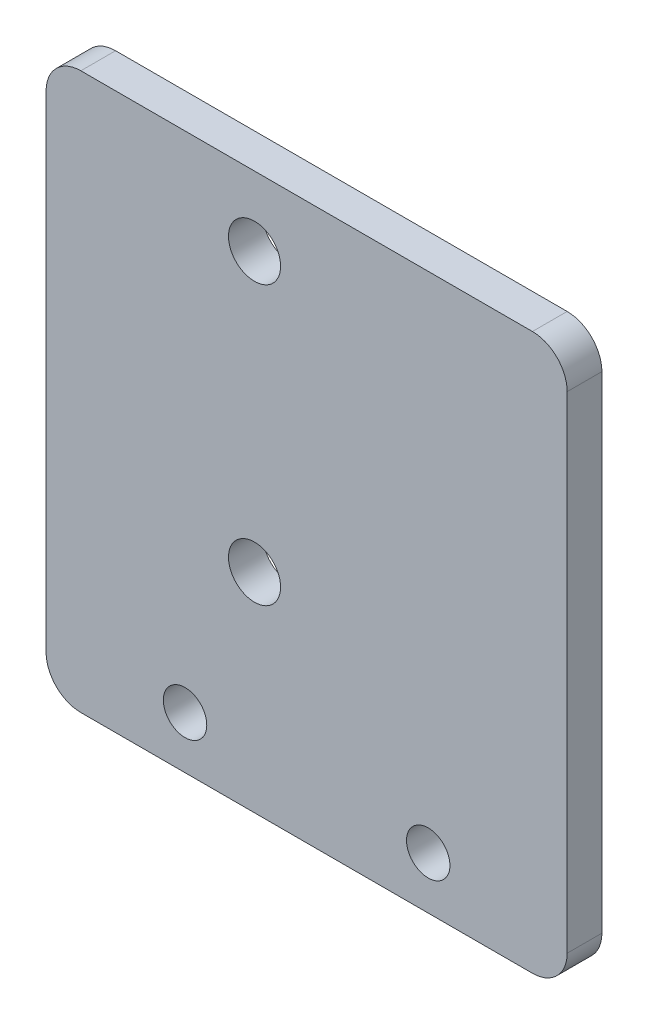
ISO-10303-21;
HEADER;
FILE_DESCRIPTION(('STEP AP214'),'2;1');
FILE_NAME('part.step','',(''),(''),'','','');
FILE_SCHEMA(('AUTOMOTIVE_DESIGN { 1 0 10303 214 1 1 1 1 }'));
ENDSEC;
DATA;
#1=APPLICATION_CONTEXT('core data for automotive mechanical design processes');
#2=APPLICATION_PROTOCOL_DEFINITION('international standard','automotive_design',2000,#1);
#3=PRODUCT_CONTEXT('',#1,'mechanical');
#4=PRODUCT('Part','Part','',(#3));
#5=PRODUCT_RELATED_PRODUCT_CATEGORY('part','',(#4));
#6=PRODUCT_DEFINITION_FORMATION('','',#4);
#7=PRODUCT_DEFINITION_CONTEXT('part definition',#1,'design');
#8=PRODUCT_DEFINITION('design','',#6,#7);
#9=PRODUCT_DEFINITION_SHAPE('','',#8);
#10=(LENGTH_UNIT() NAMED_UNIT(*) SI_UNIT(.MILLI.,.METRE.));
#11=(NAMED_UNIT(*) PLANE_ANGLE_UNIT() SI_UNIT($,.RADIAN.));
#12=(NAMED_UNIT(*) SI_UNIT($,.STERADIAN.) SOLID_ANGLE_UNIT());
#13=UNCERTAINTY_MEASURE_WITH_UNIT(LENGTH_MEASURE(1.E-05),#10,'distance_accuracy_value','');
#14=(GEOMETRIC_REPRESENTATION_CONTEXT(3) GLOBAL_UNCERTAINTY_ASSIGNED_CONTEXT((#13)) GLOBAL_UNIT_ASSIGNED_CONTEXT((#10,
#11,#12)) REPRESENTATION_CONTEXT('',''));
#15=CARTESIAN_POINT('',(0.,0.,0.));
#16=DIRECTION('',(0.,0.,1.));
#17=DIRECTION('',(1.,0.,0.));
#18=AXIS2_PLACEMENT_3D('',#15,#16,#17);
#19=CARTESIAN_POINT('',(0.,0.,2.));
#20=DIRECTION('',(0.,0.,-1.));
#21=DIRECTION('',(-1.,0.,0.));
#22=AXIS2_PLACEMENT_3D('',#19,#20,#21);
#23=PLANE('',#22);
#24=DIRECTION('',(0.,-1.,0.));
#25=VECTOR('',#24,1.);
#26=CARTESIAN_POINT('',(0.,0.,2.));
#27=LINE('',#26,#25);
#28=CARTESIAN_POINT('',(0.,30.,2.));
#29=VERTEX_POINT('',#28);
#30=CARTESIAN_POINT('',(0.,2.,2.));
#31=VERTEX_POINT('',#30);
#32=EDGE_CURVE('E150',#29,#31,#27,.T.);
#33=ORIENTED_EDGE('',*,*,#32,.T.);
#34=CARTESIAN_POINT('',(2.,2.,2.));
#35=DIRECTION('',(0.,0.,-1.));
#36=DIRECTION('',(-1.,0.,0.));
#37=AXIS2_PLACEMENT_3D('',#34,#35,#36);
#38=CIRCLE('',#37,2.);
#39=CARTESIAN_POINT('',(2.,0.,2.));
#40=VERTEX_POINT('',#39);
#41=EDGE_CURVE('E174',#31,#40,#38,.F.);
#42=ORIENTED_EDGE('',*,*,#41,.T.);
#43=DIRECTION('',(1.,0.,0.));
#44=VECTOR('',#43,1.);
#45=CARTESIAN_POINT('',(0.,0.,2.));
#46=LINE('',#45,#44);
#47=CARTESIAN_POINT('',(28.,0.,2.));
#48=VERTEX_POINT('',#47);
#49=EDGE_CURVE('E127',#40,#48,#46,.T.);
#50=ORIENTED_EDGE('',*,*,#49,.T.);
#51=CARTESIAN_POINT('',(28.,2.,2.));
#52=DIRECTION('',(0.,0.,-1.));
#53=DIRECTION('',(-1.,0.,0.));
#54=AXIS2_PLACEMENT_3D('',#51,#52,#53);
#55=CIRCLE('',#54,2.);
#56=CARTESIAN_POINT('',(30.,2.,2.));
#57=VERTEX_POINT('',#56);
#58=EDGE_CURVE('E171',#48,#57,#55,.F.);
#59=ORIENTED_EDGE('',*,*,#58,.T.);
#60=DIRECTION('',(0.,1.,0.));
#61=VECTOR('',#60,1.);
#62=CARTESIAN_POINT('',(30.,0.,2.));
#63=LINE('',#62,#61);
#64=CARTESIAN_POINT('',(30.,30.,2.));
#65=VERTEX_POINT('',#64);
#66=EDGE_CURVE('E186',#57,#65,#63,.T.);
#67=ORIENTED_EDGE('',*,*,#66,.T.);
#68=CARTESIAN_POINT('',(28.,30.,2.));
#69=DIRECTION('',(0.,0.,-1.));
#70=DIRECTION('',(-1.,0.,0.));
#71=AXIS2_PLACEMENT_3D('',#68,#69,#70);
#72=CIRCLE('',#71,2.);
#73=CARTESIAN_POINT('',(28.,32.,2.));
#74=VERTEX_POINT('',#73);
#75=EDGE_CURVE('E61',#65,#74,#72,.F.);
#76=ORIENTED_EDGE('',*,*,#75,.T.);
#77=DIRECTION('',(-1.,0.,0.));
#78=VECTOR('',#77,1.);
#79=CARTESIAN_POINT('',(0.,32.,2.));
#80=LINE('',#79,#78);
#81=CARTESIAN_POINT('',(2.,32.,2.));
#82=VERTEX_POINT('',#81);
#83=EDGE_CURVE('E152',#74,#82,#80,.T.);
#84=ORIENTED_EDGE('',*,*,#83,.T.);
#85=CARTESIAN_POINT('',(2.,30.,2.));
#86=DIRECTION('',(0.,0.,-1.));
#87=DIRECTION('',(-1.,0.,0.));
#88=AXIS2_PLACEMENT_3D('',#85,#86,#87);
#89=CIRCLE('',#88,2.);
#90=EDGE_CURVE('E166',#82,#29,#89,.F.);
#91=ORIENTED_EDGE('',*,*,#90,.T.);
#92=EDGE_LOOP('',(#33,#42,#50,#59,#67,#76,#84,#91));
#93=FACE_BOUND('',#92,.T.);
#94=CARTESIAN_POINT('',(8.,3.,2.));
#95=DIRECTION('',(0.,0.,1.));
#96=DIRECTION('',(1.,0.,0.));
#97=AXIS2_PLACEMENT_3D('',#94,#95,#96);
#98=CIRCLE('',#97,1.25);
#99=CARTESIAN_POINT('',(9.25,3.,2.));
#100=VERTEX_POINT('',#99);
#101=EDGE_CURVE('E144',#100,#100,#98,.T.);
#102=ORIENTED_EDGE('',*,*,#101,.F.);
#103=EDGE_LOOP('',(#102));
#104=FACE_BOUND('',#103,.T.);
#105=CARTESIAN_POINT('',(22.,3.,2.));
#106=DIRECTION('',(0.,0.,1.));
#107=DIRECTION('',(1.,0.,0.));
#108=AXIS2_PLACEMENT_3D('',#105,#106,#107);
#109=CIRCLE('',#108,1.25);
#110=CARTESIAN_POINT('',(23.25,3.,2.));
#111=VERTEX_POINT('',#110);
#112=EDGE_CURVE('E199',#111,#111,#109,.T.);
#113=ORIENTED_EDGE('',*,*,#112,.F.);
#114=EDGE_LOOP('',(#113));
#115=FACE_BOUND('',#114,.T.);
#116=CARTESIAN_POINT('',(12.,28.,2.));
#117=DIRECTION('',(0.,0.,1.));
#118=DIRECTION('',(1.,0.,0.));
#119=AXIS2_PLACEMENT_3D('',#116,#117,#118);
#120=CIRCLE('',#119,1.5);
#121=CARTESIAN_POINT('',(13.5,28.,2.));
#122=VERTEX_POINT('',#121);
#123=EDGE_CURVE('E207',#122,#122,#120,.T.);
#124=ORIENTED_EDGE('',*,*,#123,.F.);
#125=EDGE_LOOP('',(#124));
#126=FACE_BOUND('',#125,.T.);
#127=CARTESIAN_POINT('',(12.,12.,2.));
#128=DIRECTION('',(0.,0.,1.));
#129=DIRECTION('',(1.,0.,0.));
#130=AXIS2_PLACEMENT_3D('',#127,#128,#129);
#131=CIRCLE('',#130,1.5);
#132=CARTESIAN_POINT('',(13.5,12.,2.));
#133=VERTEX_POINT('',#132);
#134=EDGE_CURVE('E215',#133,#133,#131,.T.);
#135=ORIENTED_EDGE('',*,*,#134,.F.);
#136=EDGE_LOOP('',(#135));
#137=FACE_BOUND('',#136,.T.);
#138=ADVANCED_FACE('F39',(#93,#104,#115,#126,#137),#23,.F.);
#139=CARTESIAN_POINT('',(0.,0.,0.));
#140=DIRECTION('',(0.,0.,-1.));
#141=DIRECTION('',(-1.,0.,0.));
#142=AXIS2_PLACEMENT_3D('',#139,#140,#141);
#143=PLANE('',#142);
#144=CARTESIAN_POINT('',(12.,28.,0.));
#145=DIRECTION('',(0.,0.,1.));
#146=DIRECTION('',(1.,0.,0.));
#147=AXIS2_PLACEMENT_3D('',#144,#145,#146);
#148=CIRCLE('',#147,1.5);
#149=CARTESIAN_POINT('',(13.5,28.,0.));
#150=VERTEX_POINT('',#149);
#151=EDGE_CURVE('E211',#150,#150,#148,.T.);
#152=ORIENTED_EDGE('',*,*,#151,.T.);
#153=EDGE_LOOP('',(#152));
#154=FACE_BOUND('',#153,.T.);
#155=CARTESIAN_POINT('',(8.,3.,0.));
#156=DIRECTION('',(0.,0.,1.));
#157=DIRECTION('',(1.,0.,0.));
#158=AXIS2_PLACEMENT_3D('',#155,#156,#157);
#159=CIRCLE('',#158,1.25);
#160=CARTESIAN_POINT('',(9.25,3.,0.));
#161=VERTEX_POINT('',#160);
#162=EDGE_CURVE('E195',#161,#161,#159,.T.);
#163=ORIENTED_EDGE('',*,*,#162,.T.);
#164=EDGE_LOOP('',(#163));
#165=FACE_BOUND('',#164,.T.);
#166=DIRECTION('',(1.,0.,0.));
#167=VECTOR('',#166,1.);
#168=CARTESIAN_POINT('',(0.,0.,0.));
#169=LINE('',#168,#167);
#170=CARTESIAN_POINT('',(2.,0.,0.));
#171=VERTEX_POINT('',#170);
#172=CARTESIAN_POINT('',(28.,0.,0.));
#173=VERTEX_POINT('',#172);
#174=EDGE_CURVE('E124',#171,#173,#169,.T.);
#175=ORIENTED_EDGE('',*,*,#174,.F.);
#176=CARTESIAN_POINT('',(2.,2.,0.));
#177=DIRECTION('',(0.,0.,-1.));
#178=DIRECTION('',(-1.,0.,0.));
#179=AXIS2_PLACEMENT_3D('',#176,#177,#178);
#180=CIRCLE('',#179,2.);
#181=CARTESIAN_POINT('',(0.,2.,0.));
#182=VERTEX_POINT('',#181);
#183=EDGE_CURVE('E106',#171,#182,#180,.T.);
#184=ORIENTED_EDGE('',*,*,#183,.T.);
#185=DIRECTION('',(0.,-1.,0.));
#186=VECTOR('',#185,1.);
#187=CARTESIAN_POINT('',(0.,0.,0.));
#188=LINE('',#187,#186);
#189=CARTESIAN_POINT('',(0.,30.,0.));
#190=VERTEX_POINT('',#189);
#191=EDGE_CURVE('E137',#190,#182,#188,.T.);
#192=ORIENTED_EDGE('',*,*,#191,.F.);
#193=CARTESIAN_POINT('',(2.,30.,0.));
#194=DIRECTION('',(0.,0.,-1.));
#195=DIRECTION('',(-1.,0.,0.));
#196=AXIS2_PLACEMENT_3D('',#193,#194,#195);
#197=CIRCLE('',#196,2.);
#198=CARTESIAN_POINT('',(2.,32.,0.));
#199=VERTEX_POINT('',#198);
#200=EDGE_CURVE('E129',#190,#199,#197,.T.);
#201=ORIENTED_EDGE('',*,*,#200,.T.);
#202=DIRECTION('',(-1.,0.,0.));
#203=VECTOR('',#202,1.);
#204=CARTESIAN_POINT('',(0.,32.,0.));
#205=LINE('',#204,#203);
#206=CARTESIAN_POINT('',(28.,32.,0.));
#207=VERTEX_POINT('',#206);
#208=EDGE_CURVE('E142',#207,#199,#205,.T.);
#209=ORIENTED_EDGE('',*,*,#208,.F.);
#210=CARTESIAN_POINT('',(28.,30.,0.));
#211=DIRECTION('',(0.,0.,-1.));
#212=DIRECTION('',(-1.,0.,0.));
#213=AXIS2_PLACEMENT_3D('',#210,#211,#212);
#214=CIRCLE('',#213,2.);
#215=CARTESIAN_POINT('',(30.,30.,0.));
#216=VERTEX_POINT('',#215);
#217=EDGE_CURVE('E156',#207,#216,#214,.T.);
#218=ORIENTED_EDGE('',*,*,#217,.T.);
#219=DIRECTION('',(0.,1.,0.));
#220=VECTOR('',#219,1.);
#221=CARTESIAN_POINT('',(30.,0.,0.));
#222=LINE('',#221,#220);
#223=CARTESIAN_POINT('',(30.,2.,0.));
#224=VERTEX_POINT('',#223);
#225=EDGE_CURVE('E136',#224,#216,#222,.T.);
#226=ORIENTED_EDGE('',*,*,#225,.F.);
#227=CARTESIAN_POINT('',(28.,2.,0.));
#228=DIRECTION('',(0.,0.,-1.));
#229=DIRECTION('',(-1.,0.,0.));
#230=AXIS2_PLACEMENT_3D('',#227,#228,#229);
#231=CIRCLE('',#230,2.);
#232=EDGE_CURVE('E118',#224,#173,#231,.T.);
#233=ORIENTED_EDGE('',*,*,#232,.T.);
#234=EDGE_LOOP('',(#175,#184,#192,#201,#209,#218,#226,#233));
#235=FACE_BOUND('',#234,.T.);
#236=CARTESIAN_POINT('',(22.,3.,0.));
#237=DIRECTION('',(0.,0.,1.));
#238=DIRECTION('',(1.,0.,0.));
#239=AXIS2_PLACEMENT_3D('',#236,#237,#238);
#240=CIRCLE('',#239,1.25);
#241=CARTESIAN_POINT('',(23.25,3.,0.));
#242=VERTEX_POINT('',#241);
#243=EDGE_CURVE('E203',#242,#242,#240,.T.);
#244=ORIENTED_EDGE('',*,*,#243,.T.);
#245=EDGE_LOOP('',(#244));
#246=FACE_BOUND('',#245,.T.);
#247=CARTESIAN_POINT('',(12.,12.,0.));
#248=DIRECTION('',(0.,0.,1.));
#249=DIRECTION('',(1.,0.,0.));
#250=AXIS2_PLACEMENT_3D('',#247,#248,#249);
#251=CIRCLE('',#250,1.5);
#252=CARTESIAN_POINT('',(13.5,12.,0.));
#253=VERTEX_POINT('',#252);
#254=EDGE_CURVE('E219',#253,#253,#251,.T.);
#255=ORIENTED_EDGE('',*,*,#254,.T.);
#256=EDGE_LOOP('',(#255));
#257=FACE_BOUND('',#256,.T.);
#258=ADVANCED_FACE('F132',(#154,#165,#235,#246,#257),#143,.T.);
#259=CARTESIAN_POINT('',(0.,0.,2.));
#260=DIRECTION('',(1.,0.,0.));
#261=DIRECTION('',(0.,0.,-1.));
#262=AXIS2_PLACEMENT_3D('',#259,#260,#261);
#263=PLANE('',#262);
#264=ORIENTED_EDGE('',*,*,#191,.T.);
#265=DIRECTION('',(0.,0.,-1.));
#266=VECTOR('',#265,1.);
#267=CARTESIAN_POINT('',(0.,2.,2.));
#268=LINE('',#267,#266);
#269=EDGE_CURVE('E111',#182,#31,#268,.F.);
#270=ORIENTED_EDGE('',*,*,#269,.T.);
#271=ORIENTED_EDGE('',*,*,#32,.F.);
#272=DIRECTION('',(0.,0.,-1.));
#273=VECTOR('',#272,1.);
#274=CARTESIAN_POINT('',(0.,30.,2.));
#275=LINE('',#274,#273);
#276=EDGE_CURVE('E117',#29,#190,#275,.T.);
#277=ORIENTED_EDGE('',*,*,#276,.T.);
#278=EDGE_LOOP('',(#264,#270,#271,#277));
#279=FACE_BOUND('',#278,.T.);
#280=ADVANCED_FACE('F235',(#279),#263,.F.);
#281=CARTESIAN_POINT('',(0.,0.,2.));
#282=DIRECTION('',(0.,1.,0.));
#283=DIRECTION('',(0.,0.,1.));
#284=AXIS2_PLACEMENT_3D('',#281,#282,#283);
#285=PLANE('',#284);
#286=ORIENTED_EDGE('',*,*,#49,.F.);
#287=DIRECTION('',(0.,0.,-1.));
#288=VECTOR('',#287,1.);
#289=CARTESIAN_POINT('',(2.,0.,2.));
#290=LINE('',#289,#288);
#291=EDGE_CURVE('E110',#40,#171,#290,.T.);
#292=ORIENTED_EDGE('',*,*,#291,.T.);
#293=ORIENTED_EDGE('',*,*,#174,.T.);
#294=DIRECTION('',(0.,0.,-1.));
#295=VECTOR('',#294,1.);
#296=CARTESIAN_POINT('',(28.,0.,2.));
#297=LINE('',#296,#295);
#298=EDGE_CURVE('E130',#173,#48,#297,.F.);
#299=ORIENTED_EDGE('',*,*,#298,.T.);
#300=EDGE_LOOP('',(#286,#292,#293,#299));
#301=FACE_BOUND('',#300,.T.);
#302=ADVANCED_FACE('F123',(#301),#285,.F.);
#303=CARTESIAN_POINT('',(30.,0.,2.));
#304=DIRECTION('',(-1.,0.,0.));
#305=DIRECTION('',(0.,0.,1.));
#306=AXIS2_PLACEMENT_3D('',#303,#304,#305);
#307=PLANE('',#306);
#308=ORIENTED_EDGE('',*,*,#66,.F.);
#309=DIRECTION('',(0.,0.,-1.));
#310=VECTOR('',#309,1.);
#311=CARTESIAN_POINT('',(30.,2.,2.));
#312=LINE('',#311,#310);
#313=EDGE_CURVE('E180',#57,#224,#312,.T.);
#314=ORIENTED_EDGE('',*,*,#313,.T.);
#315=ORIENTED_EDGE('',*,*,#225,.T.);
#316=DIRECTION('',(0.,0.,-1.));
#317=VECTOR('',#316,1.);
#318=CARTESIAN_POINT('',(30.,30.,2.));
#319=LINE('',#318,#317);
#320=EDGE_CURVE('E177',#216,#65,#319,.F.);
#321=ORIENTED_EDGE('',*,*,#320,.T.);
#322=EDGE_LOOP('',(#308,#314,#315,#321));
#323=FACE_BOUND('',#322,.T.);
#324=ADVANCED_FACE('F246',(#323),#307,.F.);
#325=CARTESIAN_POINT('',(0.,32.,2.));
#326=DIRECTION('',(0.,-1.,0.));
#327=DIRECTION('',(0.,0.,-1.));
#328=AXIS2_PLACEMENT_3D('',#325,#326,#327);
#329=PLANE('',#328);
#330=ORIENTED_EDGE('',*,*,#83,.F.);
#331=DIRECTION('',(0.,0.,-1.));
#332=VECTOR('',#331,1.);
#333=CARTESIAN_POINT('',(28.,32.,2.));
#334=LINE('',#333,#332);
#335=EDGE_CURVE('E11',#74,#207,#334,.T.);
#336=ORIENTED_EDGE('',*,*,#335,.T.);
#337=ORIENTED_EDGE('',*,*,#208,.T.);
#338=DIRECTION('',(0.,0.,-1.));
#339=VECTOR('',#338,1.);
#340=CARTESIAN_POINT('',(2.,32.,2.));
#341=LINE('',#340,#339);
#342=EDGE_CURVE('E48',#199,#82,#341,.F.);
#343=ORIENTED_EDGE('',*,*,#342,.T.);
#344=EDGE_LOOP('',(#330,#336,#337,#343));
#345=FACE_BOUND('',#344,.T.);
#346=ADVANCED_FACE('F243',(#345),#329,.F.);
#347=CARTESIAN_POINT('',(8.,3.,2.));
#348=DIRECTION('',(0.,0.,-1.));
#349=DIRECTION('',(-1.,0.,0.));
#350=AXIS2_PLACEMENT_3D('',#347,#348,#349);
#351=CYLINDRICAL_SURFACE('',#350,1.25);
#352=ORIENTED_EDGE('',*,*,#101,.T.);
#353=EDGE_LOOP('',(#352));
#354=FACE_BOUND('',#353,.T.);
#355=ORIENTED_EDGE('',*,*,#162,.F.);
#356=EDGE_LOOP('',(#355));
#357=FACE_BOUND('',#356,.T.);
#358=ADVANCED_FACE('F240',(#354,#357),#351,.F.);
#359=CARTESIAN_POINT('',(22.,3.,2.));
#360=DIRECTION('',(0.,0.,-1.));
#361=DIRECTION('',(-1.,0.,0.));
#362=AXIS2_PLACEMENT_3D('',#359,#360,#361);
#363=CYLINDRICAL_SURFACE('',#362,1.25);
#364=ORIENTED_EDGE('',*,*,#112,.T.);
#365=EDGE_LOOP('',(#364));
#366=FACE_BOUND('',#365,.T.);
#367=ORIENTED_EDGE('',*,*,#243,.F.);
#368=EDGE_LOOP('',(#367));
#369=FACE_BOUND('',#368,.T.);
#370=ADVANCED_FACE('F347',(#366,#369),#363,.F.);
#371=CARTESIAN_POINT('',(12.,28.,2.));
#372=DIRECTION('',(0.,0.,-1.));
#373=DIRECTION('',(-1.,0.,0.));
#374=AXIS2_PLACEMENT_3D('',#371,#372,#373);
#375=CYLINDRICAL_SURFACE('',#374,1.5);
#376=ORIENTED_EDGE('',*,*,#123,.T.);
#377=EDGE_LOOP('',(#376));
#378=FACE_BOUND('',#377,.T.);
#379=ORIENTED_EDGE('',*,*,#151,.F.);
#380=EDGE_LOOP('',(#379));
#381=FACE_BOUND('',#380,.T.);
#382=ADVANCED_FACE('F338',(#378,#381),#375,.F.);
#383=CARTESIAN_POINT('',(12.,12.,2.));
#384=DIRECTION('',(0.,0.,-1.));
#385=DIRECTION('',(-1.,0.,0.));
#386=AXIS2_PLACEMENT_3D('',#383,#384,#385);
#387=CYLINDRICAL_SURFACE('',#386,1.5);
#388=ORIENTED_EDGE('',*,*,#134,.T.);
#389=EDGE_LOOP('',(#388));
#390=FACE_BOUND('',#389,.T.);
#391=ORIENTED_EDGE('',*,*,#254,.F.);
#392=EDGE_LOOP('',(#391));
#393=FACE_BOUND('',#392,.T.);
#394=ADVANCED_FACE('F227',(#390,#393),#387,.F.);
#395=CARTESIAN_POINT('',(2.,2.,2.));
#396=DIRECTION('',(0.,0.,-1.));
#397=DIRECTION('',(-1.,0.,0.));
#398=AXIS2_PLACEMENT_3D('',#395,#396,#397);
#399=CYLINDRICAL_SURFACE('',#398,2.);
#400=ORIENTED_EDGE('',*,*,#41,.F.);
#401=ORIENTED_EDGE('',*,*,#269,.F.);
#402=ORIENTED_EDGE('',*,*,#183,.F.);
#403=ORIENTED_EDGE('',*,*,#291,.F.);
#404=EDGE_LOOP('',(#400,#401,#402,#403));
#405=FACE_BOUND('',#404,.T.);
#406=ADVANCED_FACE('F109',(#405),#399,.T.);
#407=CARTESIAN_POINT('',(28.,2.,2.));
#408=DIRECTION('',(0.,0.,-1.));
#409=DIRECTION('',(-1.,0.,0.));
#410=AXIS2_PLACEMENT_3D('',#407,#408,#409);
#411=CYLINDRICAL_SURFACE('',#410,2.);
#412=ORIENTED_EDGE('',*,*,#58,.F.);
#413=ORIENTED_EDGE('',*,*,#298,.F.);
#414=ORIENTED_EDGE('',*,*,#232,.F.);
#415=ORIENTED_EDGE('',*,*,#313,.F.);
#416=EDGE_LOOP('',(#412,#413,#414,#415));
#417=FACE_BOUND('',#416,.T.);
#418=ADVANCED_FACE('F257',(#417),#411,.T.);
#419=CARTESIAN_POINT('',(28.,30.,2.));
#420=DIRECTION('',(0.,0.,-1.));
#421=DIRECTION('',(-1.,0.,0.));
#422=AXIS2_PLACEMENT_3D('',#419,#420,#421);
#423=CYLINDRICAL_SURFACE('',#422,2.);
#424=ORIENTED_EDGE('',*,*,#75,.F.);
#425=ORIENTED_EDGE('',*,*,#320,.F.);
#426=ORIENTED_EDGE('',*,*,#217,.F.);
#427=ORIENTED_EDGE('',*,*,#335,.F.);
#428=EDGE_LOOP('',(#424,#425,#426,#427));
#429=FACE_BOUND('',#428,.T.);
#430=ADVANCED_FACE('F259',(#429),#423,.T.);
#431=CARTESIAN_POINT('',(2.,30.,2.));
#432=DIRECTION('',(0.,0.,-1.));
#433=DIRECTION('',(-1.,0.,0.));
#434=AXIS2_PLACEMENT_3D('',#431,#432,#433);
#435=CYLINDRICAL_SURFACE('',#434,2.);
#436=ORIENTED_EDGE('',*,*,#90,.F.);
#437=ORIENTED_EDGE('',*,*,#342,.F.);
#438=ORIENTED_EDGE('',*,*,#200,.F.);
#439=ORIENTED_EDGE('',*,*,#276,.F.);
#440=EDGE_LOOP('',(#436,#437,#438,#439));
#441=FACE_BOUND('',#440,.T.);
#442=ADVANCED_FACE('F41',(#441),#435,.T.);
#443=CLOSED_SHELL('',(#138,#258,#280,#302,#324,#346,#358,#370,#382,#394,#406,#418,#430,#442));
#444=MANIFOLD_SOLID_BREP('B2',#443);
#445=ADVANCED_BREP_SHAPE_REPRESENTATION('',(#18,#444),#14);
#446=SHAPE_DEFINITION_REPRESENTATION(#9,#445);
ENDSEC;
END-ISO-10303-21;
